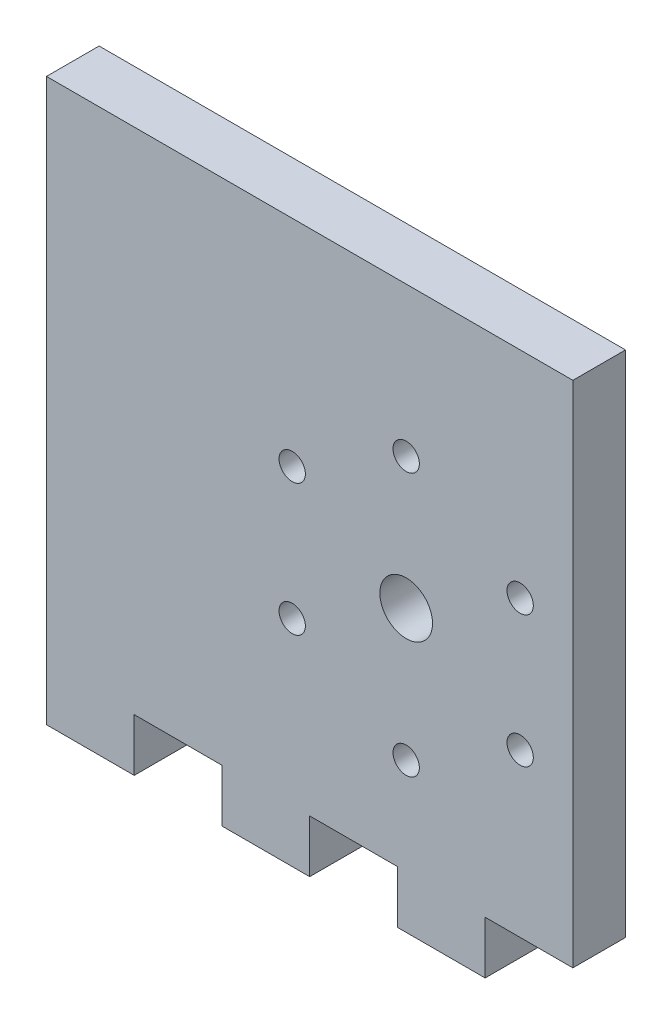
ISO-10303-21;
HEADER;
FILE_DESCRIPTION(('STEP AP214'),'2;1');
FILE_NAME('part.step','',(''),(''),'','','');
FILE_SCHEMA(('AUTOMOTIVE_DESIGN { 1 0 10303 214 1 1 1 1 }'));
ENDSEC;
DATA;
#1=APPLICATION_CONTEXT('core data for automotive mechanical design processes');
#2=APPLICATION_PROTOCOL_DEFINITION('international standard','automotive_design',2000,#1);
#3=PRODUCT_CONTEXT('',#1,'mechanical');
#4=PRODUCT('Part','Part','',(#3));
#5=PRODUCT_RELATED_PRODUCT_CATEGORY('part','',(#4));
#6=PRODUCT_DEFINITION_FORMATION('','',#4);
#7=PRODUCT_DEFINITION_CONTEXT('part definition',#1,'design');
#8=PRODUCT_DEFINITION('design','',#6,#7);
#9=PRODUCT_DEFINITION_SHAPE('','',#8);
#10=(LENGTH_UNIT() NAMED_UNIT(*) SI_UNIT(.MILLI.,.METRE.));
#11=(NAMED_UNIT(*) PLANE_ANGLE_UNIT() SI_UNIT($,.RADIAN.));
#12=(NAMED_UNIT(*) SI_UNIT($,.STERADIAN.) SOLID_ANGLE_UNIT());
#13=UNCERTAINTY_MEASURE_WITH_UNIT(LENGTH_MEASURE(1.E-05),#10,'distance_accuracy_value','');
#14=(GEOMETRIC_REPRESENTATION_CONTEXT(3) GLOBAL_UNCERTAINTY_ASSIGNED_CONTEXT((#13)) GLOBAL_UNIT_ASSIGNED_CONTEXT((#10,
#11,#12)) REPRESENTATION_CONTEXT('',''));
#15=CARTESIAN_POINT('',(0.,0.,0.));
#16=DIRECTION('',(0.,0.,1.));
#17=DIRECTION('',(1.,0.,0.));
#18=AXIS2_PLACEMENT_3D('',#15,#16,#17);
#19=CARTESIAN_POINT('',(0.,0.,3.));
#20=DIRECTION('',(0.,0.,-1.));
#21=DIRECTION('',(-1.,0.,0.));
#22=AXIS2_PLACEMENT_3D('',#19,#20,#21);
#23=PLANE('',#22);
#24=DIRECTION('',(0.,1.,0.));
#25=VECTOR('',#24,1.);
#26=CARTESIAN_POINT('',(30.,0.,3.));
#27=LINE('',#26,#25);
#28=CARTESIAN_POINT('',(30.,-26.,3.));
#29=VERTEX_POINT('',#28);
#30=CARTESIAN_POINT('',(30.,3.,3.));
#31=VERTEX_POINT('',#30);
#32=EDGE_CURVE('E106',#29,#31,#27,.T.);
#33=ORIENTED_EDGE('',*,*,#32,.T.);
#34=DIRECTION('',(-1.,0.,0.));
#35=VECTOR('',#34,1.);
#36=CARTESIAN_POINT('',(30.,3.,3.));
#37=LINE('',#36,#35);
#38=CARTESIAN_POINT('',(0.,3.,3.));
#39=VERTEX_POINT('',#38);
#40=EDGE_CURVE('E312',#31,#39,#37,.T.);
#41=ORIENTED_EDGE('',*,*,#40,.T.);
#42=DIRECTION('',(0.,-1.,0.));
#43=VECTOR('',#42,1.);
#44=CARTESIAN_POINT('',(0.,0.,3.));
#45=LINE('',#44,#43);
#46=CARTESIAN_POINT('',(0.,-29.,3.));
#47=VERTEX_POINT('',#46);
#48=EDGE_CURVE('E366',#39,#47,#45,.T.);
#49=ORIENTED_EDGE('',*,*,#48,.T.);
#50=DIRECTION('',(1.,0.,0.));
#51=VECTOR('',#50,1.);
#52=CARTESIAN_POINT('',(0.,-29.,3.));
#53=LINE('',#52,#51);
#54=CARTESIAN_POINT('',(4.99999999999994,-29.,3.));
#55=VERTEX_POINT('',#54);
#56=EDGE_CURVE('E213',#47,#55,#53,.T.);
#57=ORIENTED_EDGE('',*,*,#56,.T.);
#58=DIRECTION('',(0.,1.,0.));
#59=VECTOR('',#58,1.);
#60=CARTESIAN_POINT('',(4.99999999999994,-29.,3.));
#61=LINE('',#60,#59);
#62=CARTESIAN_POINT('',(4.99999999999994,-26.,3.));
#63=VERTEX_POINT('',#62);
#64=EDGE_CURVE('E236',#55,#63,#61,.T.);
#65=ORIENTED_EDGE('',*,*,#64,.T.);
#66=DIRECTION('',(1.,0.,0.));
#67=VECTOR('',#66,1.);
#68=CARTESIAN_POINT('',(4.99999999999994,-26.,3.));
#69=LINE('',#68,#67);
#70=CARTESIAN_POINT('',(9.99999999999994,-26.,3.));
#71=VERTEX_POINT('',#70);
#72=EDGE_CURVE('E233',#63,#71,#69,.T.);
#73=ORIENTED_EDGE('',*,*,#72,.T.);
#74=DIRECTION('',(0.,-1.,0.));
#75=VECTOR('',#74,1.);
#76=CARTESIAN_POINT('',(9.99999999999994,-26.,3.));
#77=LINE('',#76,#75);
#78=CARTESIAN_POINT('',(9.99999999999995,-29.,3.));
#79=VERTEX_POINT('',#78);
#80=EDGE_CURVE('E235',#71,#79,#77,.T.);
#81=ORIENTED_EDGE('',*,*,#80,.T.);
#82=DIRECTION('',(1.,0.,0.));
#83=VECTOR('',#82,1.);
#84=CARTESIAN_POINT('',(9.99999999999995,-29.,3.));
#85=LINE('',#84,#83);
#86=CARTESIAN_POINT('',(14.9999999999999,-29.,3.));
#87=VERTEX_POINT('',#86);
#88=EDGE_CURVE('E238',#79,#87,#85,.T.);
#89=ORIENTED_EDGE('',*,*,#88,.T.);
#90=DIRECTION('',(0.,1.,0.));
#91=VECTOR('',#90,1.);
#92=CARTESIAN_POINT('',(14.9999999999999,-29.,3.));
#93=LINE('',#92,#91);
#94=CARTESIAN_POINT('',(15.,-26.,3.));
#95=VERTEX_POINT('',#94);
#96=EDGE_CURVE('E244',#87,#95,#93,.T.);
#97=ORIENTED_EDGE('',*,*,#96,.T.);
#98=DIRECTION('',(1.,0.,0.));
#99=VECTOR('',#98,1.);
#100=CARTESIAN_POINT('',(15.,-26.,3.));
#101=LINE('',#100,#99);
#102=CARTESIAN_POINT('',(20.,-26.,3.));
#103=VERTEX_POINT('',#102);
#104=EDGE_CURVE('E141',#95,#103,#101,.T.);
#105=ORIENTED_EDGE('',*,*,#104,.T.);
#106=DIRECTION('',(0.,-1.,0.));
#107=VECTOR('',#106,1.);
#108=CARTESIAN_POINT('',(20.,-29.,3.));
#109=LINE('',#108,#107);
#110=CARTESIAN_POINT('',(20.,-29.,3.));
#111=VERTEX_POINT('',#110);
#112=EDGE_CURVE('E135',#103,#111,#109,.T.);
#113=ORIENTED_EDGE('',*,*,#112,.T.);
#114=DIRECTION('',(1.,0.,0.));
#115=VECTOR('',#114,1.);
#116=CARTESIAN_POINT('',(20.,-29.,3.));
#117=LINE('',#116,#115);
#118=CARTESIAN_POINT('',(25.,-29.,3.));
#119=VERTEX_POINT('',#118);
#120=EDGE_CURVE('E139',#111,#119,#117,.T.);
#121=ORIENTED_EDGE('',*,*,#120,.T.);
#122=DIRECTION('',(0.,1.,0.));
#123=VECTOR('',#122,1.);
#124=CARTESIAN_POINT('',(25.,-29.,3.));
#125=LINE('',#124,#123);
#126=CARTESIAN_POINT('',(25.,-26.,3.));
#127=VERTEX_POINT('',#126);
#128=EDGE_CURVE('E50',#119,#127,#125,.T.);
#129=ORIENTED_EDGE('',*,*,#128,.T.);
#130=DIRECTION('',(1.,0.,0.));
#131=VECTOR('',#130,1.);
#132=CARTESIAN_POINT('',(25.,-26.,3.));
#133=LINE('',#132,#131);
#134=EDGE_CURVE('E185',#127,#29,#133,.T.);
#135=ORIENTED_EDGE('',*,*,#134,.T.);
#136=EDGE_LOOP('',(#33,#41,#49,#57,#65,#73,#81,#89,#97,#105,#113,#121,#129,#135));
#137=FACE_BOUND('',#136,.T.);
#138=CARTESIAN_POINT('',(20.5,-5.50000000000007,3.));
#139=DIRECTION('',(0.,0.,1.));
#140=DIRECTION('',(1.,0.,0.));
#141=AXIS2_PLACEMENT_3D('',#138,#139,#140);
#142=CIRCLE('',#141,0.750000000000002);
#143=CARTESIAN_POINT('',(21.25,-5.50000000000007,3.));
#144=VERTEX_POINT('',#143);
#145=EDGE_CURVE('E163',#144,#144,#142,.T.);
#146=ORIENTED_EDGE('',*,*,#145,.F.);
#147=EDGE_LOOP('',(#146));
#148=FACE_BOUND('',#147,.T.);
#149=CARTESIAN_POINT('',(20.5,-13.0000000000001,3.));
#150=DIRECTION('',(0.,0.,1.));
#151=DIRECTION('',(1.,0.,0.));
#152=AXIS2_PLACEMENT_3D('',#149,#150,#151);
#153=CIRCLE('',#152,1.5);
#154=CARTESIAN_POINT('',(22.,-13.0000000000001,3.));
#155=VERTEX_POINT('',#154);
#156=EDGE_CURVE('E354',#155,#155,#153,.T.);
#157=ORIENTED_EDGE('',*,*,#156,.F.);
#158=EDGE_LOOP('',(#157));
#159=FACE_BOUND('',#158,.T.);
#160=CARTESIAN_POINT('',(26.9951905283833,-9.25000000000007,3.));
#161=DIRECTION('',(0.,0.,1.));
#162=DIRECTION('',(1.,0.,0.));
#163=AXIS2_PLACEMENT_3D('',#160,#161,#162);
#164=CIRCLE('',#163,0.750000000000002);
#165=CARTESIAN_POINT('',(27.7451905283833,-9.25000000000007,3.));
#166=VERTEX_POINT('',#165);
#167=EDGE_CURVE('E348',#166,#166,#164,.T.);
#168=ORIENTED_EDGE('',*,*,#167,.F.);
#169=EDGE_LOOP('',(#168));
#170=FACE_BOUND('',#169,.T.);
#171=CARTESIAN_POINT('',(26.9951905283833,-16.7500000000001,3.));
#172=DIRECTION('',(0.,0.,1.));
#173=DIRECTION('',(1.,0.,0.));
#174=AXIS2_PLACEMENT_3D('',#171,#172,#173);
#175=CIRCLE('',#174,0.750000000000005);
#176=CARTESIAN_POINT('',(27.7451905283833,-16.7500000000001,3.));
#177=VERTEX_POINT('',#176);
#178=EDGE_CURVE('E342',#177,#177,#175,.T.);
#179=ORIENTED_EDGE('',*,*,#178,.F.);
#180=EDGE_LOOP('',(#179));
#181=FACE_BOUND('',#180,.T.);
#182=CARTESIAN_POINT('',(20.5,-20.5000000000001,3.));
#183=DIRECTION('',(0.,0.,1.));
#184=DIRECTION('',(1.,0.,0.));
#185=AXIS2_PLACEMENT_3D('',#182,#183,#184);
#186=CIRCLE('',#185,0.750000000000002);
#187=CARTESIAN_POINT('',(21.25,-20.5000000000001,3.));
#188=VERTEX_POINT('',#187);
#189=EDGE_CURVE('E336',#188,#188,#186,.T.);
#190=ORIENTED_EDGE('',*,*,#189,.F.);
#191=EDGE_LOOP('',(#190));
#192=FACE_BOUND('',#191,.T.);
#193=CARTESIAN_POINT('',(14.0048094716167,-16.7500000000001,3.));
#194=DIRECTION('',(0.,0.,1.));
#195=DIRECTION('',(1.,0.,0.));
#196=AXIS2_PLACEMENT_3D('',#193,#194,#195);
#197=CIRCLE('',#196,0.750000000000002);
#198=CARTESIAN_POINT('',(14.7548094716167,-16.7500000000001,3.));
#199=VERTEX_POINT('',#198);
#200=EDGE_CURVE('E330',#199,#199,#197,.T.);
#201=ORIENTED_EDGE('',*,*,#200,.F.);
#202=EDGE_LOOP('',(#201));
#203=FACE_BOUND('',#202,.T.);
#204=CARTESIAN_POINT('',(14.0048094716167,-9.25000000000008,3.));
#205=DIRECTION('',(0.,0.,1.));
#206=DIRECTION('',(1.,0.,0.));
#207=AXIS2_PLACEMENT_3D('',#204,#205,#206);
#208=CIRCLE('',#207,0.750000000000002);
#209=CARTESIAN_POINT('',(14.7548094716167,-9.25000000000008,3.));
#210=VERTEX_POINT('',#209);
#211=EDGE_CURVE('E324',#210,#210,#208,.T.);
#212=ORIENTED_EDGE('',*,*,#211,.F.);
#213=EDGE_LOOP('',(#212));
#214=FACE_BOUND('',#213,.T.);
#215=ADVANCED_FACE('F33',(#137,#148,#159,#170,#181,#192,#203,#214),#23,.F.);
#216=CARTESIAN_POINT('',(0.,0.,0.));
#217=DIRECTION('',(0.,0.,-1.));
#218=DIRECTION('',(-1.,0.,0.));
#219=AXIS2_PLACEMENT_3D('',#216,#217,#218);
#220=PLANE('',#219);
#221=DIRECTION('',(0.,-1.,0.));
#222=VECTOR('',#221,1.);
#223=CARTESIAN_POINT('',(0.,0.,0.));
#224=LINE('',#223,#222);
#225=CARTESIAN_POINT('',(0.,3.,0.));
#226=VERTEX_POINT('',#225);
#227=CARTESIAN_POINT('',(0.,-29.,0.));
#228=VERTEX_POINT('',#227);
#229=EDGE_CURVE('E166',#226,#228,#224,.T.);
#230=ORIENTED_EDGE('',*,*,#229,.F.);
#231=DIRECTION('',(-1.,0.,0.));
#232=VECTOR('',#231,1.);
#233=CARTESIAN_POINT('',(30.,3.,0.));
#234=LINE('',#233,#232);
#235=CARTESIAN_POINT('',(30.,3.,0.));
#236=VERTEX_POINT('',#235);
#237=EDGE_CURVE('E317',#236,#226,#234,.T.);
#238=ORIENTED_EDGE('',*,*,#237,.F.);
#239=DIRECTION('',(0.,1.,0.));
#240=VECTOR('',#239,1.);
#241=CARTESIAN_POINT('',(30.,0.,0.));
#242=LINE('',#241,#240);
#243=CARTESIAN_POINT('',(30.,-26.,0.));
#244=VERTEX_POINT('',#243);
#245=EDGE_CURVE('E162',#244,#236,#242,.T.);
#246=ORIENTED_EDGE('',*,*,#245,.F.);
#247=DIRECTION('',(1.,0.,0.));
#248=VECTOR('',#247,1.);
#249=CARTESIAN_POINT('',(25.,-26.,0.));
#250=LINE('',#249,#248);
#251=CARTESIAN_POINT('',(25.,-26.,0.));
#252=VERTEX_POINT('',#251);
#253=EDGE_CURVE('E159',#252,#244,#250,.T.);
#254=ORIENTED_EDGE('',*,*,#253,.F.);
#255=DIRECTION('',(0.,1.,0.));
#256=VECTOR('',#255,1.);
#257=CARTESIAN_POINT('',(25.,-29.,0.));
#258=LINE('',#257,#256);
#259=CARTESIAN_POINT('',(25.,-29.,0.));
#260=VERTEX_POINT('',#259);
#261=EDGE_CURVE('E98',#260,#252,#258,.T.);
#262=ORIENTED_EDGE('',*,*,#261,.F.);
#263=DIRECTION('',(1.,0.,0.));
#264=VECTOR('',#263,1.);
#265=CARTESIAN_POINT('',(20.,-29.,0.));
#266=LINE('',#265,#264);
#267=CARTESIAN_POINT('',(20.,-29.,0.));
#268=VERTEX_POINT('',#267);
#269=EDGE_CURVE('E92',#268,#260,#266,.T.);
#270=ORIENTED_EDGE('',*,*,#269,.F.);
#271=DIRECTION('',(0.,-1.,0.));
#272=VECTOR('',#271,1.);
#273=CARTESIAN_POINT('',(20.,-29.,0.));
#274=LINE('',#273,#272);
#275=CARTESIAN_POINT('',(20.,-26.,0.));
#276=VERTEX_POINT('',#275);
#277=EDGE_CURVE('E149',#276,#268,#274,.T.);
#278=ORIENTED_EDGE('',*,*,#277,.F.);
#279=DIRECTION('',(1.,0.,0.));
#280=VECTOR('',#279,1.);
#281=CARTESIAN_POINT('',(15.,-26.,0.));
#282=LINE('',#281,#280);
#283=CARTESIAN_POINT('',(15.,-26.,0.));
#284=VERTEX_POINT('',#283);
#285=EDGE_CURVE('E180',#284,#276,#282,.T.);
#286=ORIENTED_EDGE('',*,*,#285,.F.);
#287=DIRECTION('',(0.,1.,0.));
#288=VECTOR('',#287,1.);
#289=CARTESIAN_POINT('',(14.9999999999999,-29.,0.));
#290=LINE('',#289,#288);
#291=CARTESIAN_POINT('',(14.9999999999999,-29.,0.));
#292=VERTEX_POINT('',#291);
#293=EDGE_CURVE('E178',#292,#284,#290,.T.);
#294=ORIENTED_EDGE('',*,*,#293,.F.);
#295=DIRECTION('',(1.,0.,0.));
#296=VECTOR('',#295,1.);
#297=CARTESIAN_POINT('',(9.99999999999995,-29.,0.));
#298=LINE('',#297,#296);
#299=CARTESIAN_POINT('',(9.99999999999995,-29.,0.));
#300=VERTEX_POINT('',#299);
#301=EDGE_CURVE('E176',#300,#292,#298,.T.);
#302=ORIENTED_EDGE('',*,*,#301,.F.);
#303=DIRECTION('',(0.,-1.,0.));
#304=VECTOR('',#303,1.);
#305=CARTESIAN_POINT('',(9.99999999999994,-26.,0.));
#306=LINE('',#305,#304);
#307=CARTESIAN_POINT('',(9.99999999999994,-26.,0.));
#308=VERTEX_POINT('',#307);
#309=EDGE_CURVE('E174',#308,#300,#306,.T.);
#310=ORIENTED_EDGE('',*,*,#309,.F.);
#311=DIRECTION('',(1.,0.,0.));
#312=VECTOR('',#311,1.);
#313=CARTESIAN_POINT('',(4.99999999999994,-26.,0.));
#314=LINE('',#313,#312);
#315=CARTESIAN_POINT('',(4.99999999999994,-26.,0.));
#316=VERTEX_POINT('',#315);
#317=EDGE_CURVE('E172',#316,#308,#314,.T.);
#318=ORIENTED_EDGE('',*,*,#317,.F.);
#319=DIRECTION('',(0.,1.,0.));
#320=VECTOR('',#319,1.);
#321=CARTESIAN_POINT('',(4.99999999999994,-29.,0.));
#322=LINE('',#321,#320);
#323=CARTESIAN_POINT('',(4.99999999999994,-29.,0.));
#324=VERTEX_POINT('',#323);
#325=EDGE_CURVE('E170',#324,#316,#322,.T.);
#326=ORIENTED_EDGE('',*,*,#325,.F.);
#327=DIRECTION('',(1.,0.,0.));
#328=VECTOR('',#327,1.);
#329=CARTESIAN_POINT('',(0.,-29.,0.));
#330=LINE('',#329,#328);
#331=EDGE_CURVE('E168',#228,#324,#330,.T.);
#332=ORIENTED_EDGE('',*,*,#331,.F.);
#333=EDGE_LOOP('',(#230,#238,#246,#254,#262,#270,#278,#286,#294,#302,#310,#318,#326,#332));
#334=FACE_BOUND('',#333,.T.);
#335=CARTESIAN_POINT('',(14.0048094716167,-16.7500000000001,0.));
#336=DIRECTION('',(0.,0.,1.));
#337=DIRECTION('',(1.,0.,0.));
#338=AXIS2_PLACEMENT_3D('',#335,#336,#337);
#339=CIRCLE('',#338,0.750000000000002);
#340=CARTESIAN_POINT('',(14.7548094716167,-16.7500000000001,0.));
#341=VERTEX_POINT('',#340);
#342=EDGE_CURVE('E327',#341,#341,#339,.T.);
#343=ORIENTED_EDGE('',*,*,#342,.T.);
#344=EDGE_LOOP('',(#343));
#345=FACE_BOUND('',#344,.T.);
#346=CARTESIAN_POINT('',(26.9951905283833,-16.7500000000001,0.));
#347=DIRECTION('',(0.,0.,1.));
#348=DIRECTION('',(1.,0.,0.));
#349=AXIS2_PLACEMENT_3D('',#346,#347,#348);
#350=CIRCLE('',#349,0.750000000000005);
#351=CARTESIAN_POINT('',(27.7451905283833,-16.7500000000001,0.));
#352=VERTEX_POINT('',#351);
#353=EDGE_CURVE('E339',#352,#352,#350,.T.);
#354=ORIENTED_EDGE('',*,*,#353,.T.);
#355=EDGE_LOOP('',(#354));
#356=FACE_BOUND('',#355,.T.);
#357=CARTESIAN_POINT('',(20.5,-13.0000000000001,0.));
#358=DIRECTION('',(0.,0.,1.));
#359=DIRECTION('',(1.,0.,0.));
#360=AXIS2_PLACEMENT_3D('',#357,#358,#359);
#361=CIRCLE('',#360,1.5);
#362=CARTESIAN_POINT('',(22.,-13.0000000000001,0.));
#363=VERTEX_POINT('',#362);
#364=EDGE_CURVE('E351',#363,#363,#361,.T.);
#365=ORIENTED_EDGE('',*,*,#364,.T.);
#366=EDGE_LOOP('',(#365));
#367=FACE_BOUND('',#366,.T.);
#368=CARTESIAN_POINT('',(20.5,-5.50000000000007,0.));
#369=DIRECTION('',(0.,0.,1.));
#370=DIRECTION('',(1.,0.,0.));
#371=AXIS2_PLACEMENT_3D('',#368,#369,#370);
#372=CIRCLE('',#371,0.750000000000002);
#373=CARTESIAN_POINT('',(21.25,-5.50000000000007,0.));
#374=VERTEX_POINT('',#373);
#375=EDGE_CURVE('E357',#374,#374,#372,.T.);
#376=ORIENTED_EDGE('',*,*,#375,.T.);
#377=EDGE_LOOP('',(#376));
#378=FACE_BOUND('',#377,.T.);
#379=CARTESIAN_POINT('',(26.9951905283833,-9.25000000000007,0.));
#380=DIRECTION('',(0.,0.,1.));
#381=DIRECTION('',(1.,0.,0.));
#382=AXIS2_PLACEMENT_3D('',#379,#380,#381);
#383=CIRCLE('',#382,0.750000000000002);
#384=CARTESIAN_POINT('',(27.7451905283833,-9.25000000000007,0.));
#385=VERTEX_POINT('',#384);
#386=EDGE_CURVE('E345',#385,#385,#383,.T.);
#387=ORIENTED_EDGE('',*,*,#386,.T.);
#388=EDGE_LOOP('',(#387));
#389=FACE_BOUND('',#388,.T.);
#390=CARTESIAN_POINT('',(20.5,-20.5000000000001,0.));
#391=DIRECTION('',(0.,0.,1.));
#392=DIRECTION('',(1.,0.,0.));
#393=AXIS2_PLACEMENT_3D('',#390,#391,#392);
#394=CIRCLE('',#393,0.750000000000002);
#395=CARTESIAN_POINT('',(21.25,-20.5000000000001,0.));
#396=VERTEX_POINT('',#395);
#397=EDGE_CURVE('E333',#396,#396,#394,.T.);
#398=ORIENTED_EDGE('',*,*,#397,.T.);
#399=EDGE_LOOP('',(#398));
#400=FACE_BOUND('',#399,.T.);
#401=CARTESIAN_POINT('',(14.0048094716167,-9.25000000000008,0.));
#402=DIRECTION('',(0.,0.,1.));
#403=DIRECTION('',(1.,0.,0.));
#404=AXIS2_PLACEMENT_3D('',#401,#402,#403);
#405=CIRCLE('',#404,0.750000000000002);
#406=CARTESIAN_POINT('',(14.7548094716167,-9.25000000000008,0.));
#407=VERTEX_POINT('',#406);
#408=EDGE_CURVE('E322',#407,#407,#405,.T.);
#409=ORIENTED_EDGE('',*,*,#408,.T.);
#410=EDGE_LOOP('',(#409));
#411=FACE_BOUND('',#410,.T.);
#412=ADVANCED_FACE('F219',(#334,#345,#356,#367,#378,#389,#400,#411),#220,.T.);
#413=CARTESIAN_POINT('',(25.,-26.,3.));
#414=DIRECTION('',(0.,1.,0.));
#415=DIRECTION('',(-1.,0.,0.));
#416=AXIS2_PLACEMENT_3D('',#413,#414,#415);
#417=PLANE('',#416);
#418=ORIENTED_EDGE('',*,*,#253,.T.);
#419=DIRECTION('',(0.,0.,-1.));
#420=VECTOR('',#419,1.);
#421=CARTESIAN_POINT('',(30.,-26.,3.));
#422=LINE('',#421,#420);
#423=EDGE_CURVE('E11',#29,#244,#422,.T.);
#424=ORIENTED_EDGE('',*,*,#423,.F.);
#425=ORIENTED_EDGE('',*,*,#134,.F.);
#426=DIRECTION('',(0.,0.,-1.));
#427=VECTOR('',#426,1.);
#428=CARTESIAN_POINT('',(25.,-26.,3.));
#429=LINE('',#428,#427);
#430=EDGE_CURVE('E155',#127,#252,#429,.T.);
#431=ORIENTED_EDGE('',*,*,#430,.T.);
#432=EDGE_LOOP('',(#418,#424,#425,#431));
#433=FACE_BOUND('',#432,.T.);
#434=ADVANCED_FACE('F35',(#433),#417,.F.);
#435=CARTESIAN_POINT('',(30.,0.,3.));
#436=DIRECTION('',(-1.,0.,0.));
#437=DIRECTION('',(0.,-1.,0.));
#438=AXIS2_PLACEMENT_3D('',#435,#436,#437);
#439=PLANE('',#438);
#440=ORIENTED_EDGE('',*,*,#245,.T.);
#441=DIRECTION('',(0.,0.,1.));
#442=VECTOR('',#441,1.);
#443=CARTESIAN_POINT('',(30.,3.,0.));
#444=LINE('',#443,#442);
#445=EDGE_CURVE('E315',#236,#31,#444,.T.);
#446=ORIENTED_EDGE('',*,*,#445,.T.);
#447=ORIENTED_EDGE('',*,*,#32,.F.);
#448=ORIENTED_EDGE('',*,*,#423,.T.);
#449=EDGE_LOOP('',(#440,#446,#447,#448));
#450=FACE_BOUND('',#449,.T.);
#451=ADVANCED_FACE('F370',(#450),#439,.F.);
#452=CARTESIAN_POINT('',(0.,0.,3.));
#453=DIRECTION('',(1.,0.,0.));
#454=DIRECTION('',(0.,1.,0.));
#455=AXIS2_PLACEMENT_3D('',#452,#453,#454);
#456=PLANE('',#455);
#457=ORIENTED_EDGE('',*,*,#229,.T.);
#458=DIRECTION('',(0.,0.,-1.));
#459=VECTOR('',#458,1.);
#460=CARTESIAN_POINT('',(0.,-29.,3.));
#461=LINE('',#460,#459);
#462=EDGE_CURVE('E42',#47,#228,#461,.T.);
#463=ORIENTED_EDGE('',*,*,#462,.F.);
#464=ORIENTED_EDGE('',*,*,#48,.F.);
#465=DIRECTION('',(0.,0.,1.));
#466=VECTOR('',#465,1.);
#467=CARTESIAN_POINT('',(0.,3.,0.));
#468=LINE('',#467,#466);
#469=EDGE_CURVE('E316',#226,#39,#468,.T.);
#470=ORIENTED_EDGE('',*,*,#469,.F.);
#471=EDGE_LOOP('',(#457,#463,#464,#470));
#472=FACE_BOUND('',#471,.T.);
#473=ADVANCED_FACE('F367',(#472),#456,.F.);
#474=CARTESIAN_POINT('',(0.,-29.,3.));
#475=DIRECTION('',(0.,1.,0.));
#476=DIRECTION('',(0.,0.,1.));
#477=AXIS2_PLACEMENT_3D('',#474,#475,#476);
#478=PLANE('',#477);
#479=ORIENTED_EDGE('',*,*,#331,.T.);
#480=DIRECTION('',(0.,0.,-1.));
#481=VECTOR('',#480,1.);
#482=CARTESIAN_POINT('',(4.99999999999994,-29.,3.));
#483=LINE('',#482,#481);
#484=EDGE_CURVE('E204',#55,#324,#483,.T.);
#485=ORIENTED_EDGE('',*,*,#484,.F.);
#486=ORIENTED_EDGE('',*,*,#56,.F.);
#487=ORIENTED_EDGE('',*,*,#462,.T.);
#488=EDGE_LOOP('',(#479,#485,#486,#487));
#489=FACE_BOUND('',#488,.T.);
#490=ADVANCED_FACE('F211',(#489),#478,.F.);
#491=CARTESIAN_POINT('',(4.99999999999994,-29.,3.));
#492=DIRECTION('',(-1.,0.,0.));
#493=DIRECTION('',(0.,0.,1.));
#494=AXIS2_PLACEMENT_3D('',#491,#492,#493);
#495=PLANE('',#494);
#496=ORIENTED_EDGE('',*,*,#325,.T.);
#497=DIRECTION('',(0.,0.,-1.));
#498=VECTOR('',#497,1.);
#499=CARTESIAN_POINT('',(4.99999999999994,-26.,3.));
#500=LINE('',#499,#498);
#501=EDGE_CURVE('E201',#63,#316,#500,.T.);
#502=ORIENTED_EDGE('',*,*,#501,.F.);
#503=ORIENTED_EDGE('',*,*,#64,.F.);
#504=ORIENTED_EDGE('',*,*,#484,.T.);
#505=EDGE_LOOP('',(#496,#502,#503,#504));
#506=FACE_BOUND('',#505,.T.);
#507=ADVANCED_FACE('F227',(#506),#495,.F.);
#508=CARTESIAN_POINT('',(4.99999999999994,-26.,3.));
#509=DIRECTION('',(0.,1.,0.));
#510=DIRECTION('',(-1.,0.,0.));
#511=AXIS2_PLACEMENT_3D('',#508,#509,#510);
#512=PLANE('',#511);
#513=ORIENTED_EDGE('',*,*,#317,.T.);
#514=DIRECTION('',(0.,0.,-1.));
#515=VECTOR('',#514,1.);
#516=CARTESIAN_POINT('',(9.99999999999994,-26.,3.));
#517=LINE('',#516,#515);
#518=EDGE_CURVE('E198',#71,#308,#517,.T.);
#519=ORIENTED_EDGE('',*,*,#518,.F.);
#520=ORIENTED_EDGE('',*,*,#72,.F.);
#521=ORIENTED_EDGE('',*,*,#501,.T.);
#522=EDGE_LOOP('',(#513,#519,#520,#521));
#523=FACE_BOUND('',#522,.T.);
#524=ADVANCED_FACE('F231',(#523),#512,.F.);
#525=CARTESIAN_POINT('',(9.99999999999994,-26.,3.));
#526=DIRECTION('',(1.,0.,0.));
#527=DIRECTION('',(0.,1.,0.));
#528=AXIS2_PLACEMENT_3D('',#525,#526,#527);
#529=PLANE('',#528);
#530=ORIENTED_EDGE('',*,*,#309,.T.);
#531=DIRECTION('',(0.,0.,-1.));
#532=VECTOR('',#531,1.);
#533=CARTESIAN_POINT('',(9.99999999999995,-29.,3.));
#534=LINE('',#533,#532);
#535=EDGE_CURVE('E195',#79,#300,#534,.T.);
#536=ORIENTED_EDGE('',*,*,#535,.F.);
#537=ORIENTED_EDGE('',*,*,#80,.F.);
#538=ORIENTED_EDGE('',*,*,#518,.T.);
#539=EDGE_LOOP('',(#530,#536,#537,#538));
#540=FACE_BOUND('',#539,.T.);
#541=ADVANCED_FACE('F383',(#540),#529,.F.);
#542=CARTESIAN_POINT('',(9.99999999999995,-29.,3.));
#543=DIRECTION('',(0.,1.,0.));
#544=DIRECTION('',(0.,0.,1.));
#545=AXIS2_PLACEMENT_3D('',#542,#543,#544);
#546=PLANE('',#545);
#547=ORIENTED_EDGE('',*,*,#301,.T.);
#548=DIRECTION('',(0.,0.,-1.));
#549=VECTOR('',#548,1.);
#550=CARTESIAN_POINT('',(14.9999999999999,-29.,3.));
#551=LINE('',#550,#549);
#552=EDGE_CURVE('E192',#87,#292,#551,.T.);
#553=ORIENTED_EDGE('',*,*,#552,.F.);
#554=ORIENTED_EDGE('',*,*,#88,.F.);
#555=ORIENTED_EDGE('',*,*,#535,.T.);
#556=EDGE_LOOP('',(#547,#553,#554,#555));
#557=FACE_BOUND('',#556,.T.);
#558=ADVANCED_FACE('F386',(#557),#546,.F.);
#559=CARTESIAN_POINT('',(14.9999999999999,-29.,3.));
#560=DIRECTION('',(-1.,0.,0.));
#561=DIRECTION('',(0.,-1.,0.));
#562=AXIS2_PLACEMENT_3D('',#559,#560,#561);
#563=PLANE('',#562);
#564=ORIENTED_EDGE('',*,*,#293,.T.);
#565=DIRECTION('',(0.,0.,-1.));
#566=VECTOR('',#565,1.);
#567=CARTESIAN_POINT('',(15.,-26.,3.));
#568=LINE('',#567,#566);
#569=EDGE_CURVE('E189',#95,#284,#568,.T.);
#570=ORIENTED_EDGE('',*,*,#569,.F.);
#571=ORIENTED_EDGE('',*,*,#96,.F.);
#572=ORIENTED_EDGE('',*,*,#552,.T.);
#573=EDGE_LOOP('',(#564,#570,#571,#572));
#574=FACE_BOUND('',#573,.T.);
#575=ADVANCED_FACE('F250',(#574),#563,.F.);
#576=CARTESIAN_POINT('',(15.,-26.,3.));
#577=DIRECTION('',(0.,1.,0.));
#578=DIRECTION('',(-1.,0.,0.));
#579=AXIS2_PLACEMENT_3D('',#576,#577,#578);
#580=PLANE('',#579);
#581=ORIENTED_EDGE('',*,*,#285,.T.);
#582=DIRECTION('',(0.,0.,-1.));
#583=VECTOR('',#582,1.);
#584=CARTESIAN_POINT('',(20.,-26.,3.));
#585=LINE('',#584,#583);
#586=EDGE_CURVE('E150',#103,#276,#585,.T.);
#587=ORIENTED_EDGE('',*,*,#586,.F.);
#588=ORIENTED_EDGE('',*,*,#104,.F.);
#589=ORIENTED_EDGE('',*,*,#569,.T.);
#590=EDGE_LOOP('',(#581,#587,#588,#589));
#591=FACE_BOUND('',#590,.T.);
#592=ADVANCED_FACE('F254',(#591),#580,.F.);
#593=CARTESIAN_POINT('',(20.,-29.,3.));
#594=DIRECTION('',(1.,0.,0.));
#595=DIRECTION('',(0.,1.,0.));
#596=AXIS2_PLACEMENT_3D('',#593,#594,#595);
#597=PLANE('',#596);
#598=ORIENTED_EDGE('',*,*,#277,.T.);
#599=DIRECTION('',(0.,0.,-1.));
#600=VECTOR('',#599,1.);
#601=CARTESIAN_POINT('',(20.,-29.,3.));
#602=LINE('',#601,#600);
#603=EDGE_CURVE('E146',#111,#268,#602,.T.);
#604=ORIENTED_EDGE('',*,*,#603,.F.);
#605=ORIENTED_EDGE('',*,*,#112,.F.);
#606=ORIENTED_EDGE('',*,*,#586,.T.);
#607=EDGE_LOOP('',(#598,#604,#605,#606));
#608=FACE_BOUND('',#607,.T.);
#609=ADVANCED_FACE('F147',(#608),#597,.F.);
#610=CARTESIAN_POINT('',(20.,-29.,3.));
#611=DIRECTION('',(0.,1.,0.));
#612=DIRECTION('',(-1.,0.,0.));
#613=AXIS2_PLACEMENT_3D('',#610,#611,#612);
#614=PLANE('',#613);
#615=ORIENTED_EDGE('',*,*,#269,.T.);
#616=DIRECTION('',(0.,0.,-1.));
#617=VECTOR('',#616,1.);
#618=CARTESIAN_POINT('',(25.,-29.,3.));
#619=LINE('',#618,#617);
#620=EDGE_CURVE('E151',#119,#260,#619,.T.);
#621=ORIENTED_EDGE('',*,*,#620,.F.);
#622=ORIENTED_EDGE('',*,*,#120,.F.);
#623=ORIENTED_EDGE('',*,*,#603,.T.);
#624=EDGE_LOOP('',(#615,#621,#622,#623));
#625=FACE_BOUND('',#624,.T.);
#626=ADVANCED_FACE('F153',(#625),#614,.F.);
#627=CARTESIAN_POINT('',(25.,-29.,3.));
#628=DIRECTION('',(-1.,0.,0.));
#629=DIRECTION('',(0.,-1.,0.));
#630=AXIS2_PLACEMENT_3D('',#627,#628,#629);
#631=PLANE('',#630);
#632=ORIENTED_EDGE('',*,*,#261,.T.);
#633=ORIENTED_EDGE('',*,*,#430,.F.);
#634=ORIENTED_EDGE('',*,*,#128,.F.);
#635=ORIENTED_EDGE('',*,*,#620,.T.);
#636=EDGE_LOOP('',(#632,#633,#634,#635));
#637=FACE_BOUND('',#636,.T.);
#638=ADVANCED_FACE('F259',(#637),#631,.F.);
#639=CARTESIAN_POINT('',(20.5,-5.50000000000007,3.));
#640=DIRECTION('',(0.,0.,-1.));
#641=DIRECTION('',(-1.,0.,0.));
#642=AXIS2_PLACEMENT_3D('',#639,#640,#641);
#643=CYLINDRICAL_SURFACE('',#642,0.750000000000002);
#644=ORIENTED_EDGE('',*,*,#145,.T.);
#645=EDGE_LOOP('',(#644));
#646=FACE_BOUND('',#645,.T.);
#647=ORIENTED_EDGE('',*,*,#375,.F.);
#648=EDGE_LOOP('',(#647));
#649=FACE_BOUND('',#648,.T.);
#650=ADVANCED_FACE('F261',(#646,#649),#643,.F.);
#651=CARTESIAN_POINT('',(20.5,-13.0000000000001,3.));
#652=DIRECTION('',(0.,0.,-1.));
#653=DIRECTION('',(-1.,0.,0.));
#654=AXIS2_PLACEMENT_3D('',#651,#652,#653);
#655=CYLINDRICAL_SURFACE('',#654,1.5);
#656=ORIENTED_EDGE('',*,*,#156,.T.);
#657=EDGE_LOOP('',(#656));
#658=FACE_BOUND('',#657,.T.);
#659=ORIENTED_EDGE('',*,*,#364,.F.);
#660=EDGE_LOOP('',(#659));
#661=FACE_BOUND('',#660,.T.);
#662=ADVANCED_FACE('F267',(#658,#661),#655,.F.);
#663=CARTESIAN_POINT('',(26.9951905283833,-9.25000000000007,3.));
#664=DIRECTION('',(0.,0.,-1.));
#665=DIRECTION('',(-1.,0.,0.));
#666=AXIS2_PLACEMENT_3D('',#663,#664,#665);
#667=CYLINDRICAL_SURFACE('',#666,0.750000000000002);
#668=ORIENTED_EDGE('',*,*,#167,.T.);
#669=EDGE_LOOP('',(#668));
#670=FACE_BOUND('',#669,.T.);
#671=ORIENTED_EDGE('',*,*,#386,.F.);
#672=EDGE_LOOP('',(#671));
#673=FACE_BOUND('',#672,.T.);
#674=ADVANCED_FACE('F281',(#670,#673),#667,.F.);
#675=CARTESIAN_POINT('',(26.9951905283833,-16.7500000000001,3.));
#676=DIRECTION('',(0.,0.,-1.));
#677=DIRECTION('',(-1.,0.,0.));
#678=AXIS2_PLACEMENT_3D('',#675,#676,#677);
#679=CYLINDRICAL_SURFACE('',#678,0.750000000000005);
#680=ORIENTED_EDGE('',*,*,#178,.T.);
#681=EDGE_LOOP('',(#680));
#682=FACE_BOUND('',#681,.T.);
#683=ORIENTED_EDGE('',*,*,#353,.F.);
#684=EDGE_LOOP('',(#683));
#685=FACE_BOUND('',#684,.T.);
#686=ADVANCED_FACE('F285',(#682,#685),#679,.F.);
#687=CARTESIAN_POINT('',(20.5,-20.5000000000001,3.));
#688=DIRECTION('',(0.,0.,-1.));
#689=DIRECTION('',(-1.,0.,0.));
#690=AXIS2_PLACEMENT_3D('',#687,#688,#689);
#691=CYLINDRICAL_SURFACE('',#690,0.750000000000002);
#692=ORIENTED_EDGE('',*,*,#189,.T.);
#693=EDGE_LOOP('',(#692));
#694=FACE_BOUND('',#693,.T.);
#695=ORIENTED_EDGE('',*,*,#397,.F.);
#696=EDGE_LOOP('',(#695));
#697=FACE_BOUND('',#696,.T.);
#698=ADVANCED_FACE('F289',(#694,#697),#691,.F.);
#699=CARTESIAN_POINT('',(14.0048094716167,-16.7500000000001,3.));
#700=DIRECTION('',(0.,0.,-1.));
#701=DIRECTION('',(-1.,0.,0.));
#702=AXIS2_PLACEMENT_3D('',#699,#700,#701);
#703=CYLINDRICAL_SURFACE('',#702,0.750000000000002);
#704=ORIENTED_EDGE('',*,*,#200,.T.);
#705=EDGE_LOOP('',(#704));
#706=FACE_BOUND('',#705,.T.);
#707=ORIENTED_EDGE('',*,*,#342,.F.);
#708=EDGE_LOOP('',(#707));
#709=FACE_BOUND('',#708,.T.);
#710=ADVANCED_FACE('F293',(#706,#709),#703,.F.);
#711=CARTESIAN_POINT('',(14.0048094716167,-9.25000000000008,3.));
#712=DIRECTION('',(0.,0.,-1.));
#713=DIRECTION('',(-1.,0.,0.));
#714=AXIS2_PLACEMENT_3D('',#711,#712,#713);
#715=CYLINDRICAL_SURFACE('',#714,0.750000000000002);
#716=ORIENTED_EDGE('',*,*,#211,.T.);
#717=EDGE_LOOP('',(#716));
#718=FACE_BOUND('',#717,.T.);
#719=ORIENTED_EDGE('',*,*,#408,.F.);
#720=EDGE_LOOP('',(#719));
#721=FACE_BOUND('',#720,.T.);
#722=ADVANCED_FACE('F297',(#718,#721),#715,.F.);
#723=CARTESIAN_POINT('',(30.,3.,0.));
#724=DIRECTION('',(0.,1.,0.));
#725=DIRECTION('',(-1.,0.,0.));
#726=AXIS2_PLACEMENT_3D('',#723,#724,#725);
#727=PLANE('',#726);
#728=ORIENTED_EDGE('',*,*,#40,.F.);
#729=ORIENTED_EDGE('',*,*,#445,.F.);
#730=ORIENTED_EDGE('',*,*,#237,.T.);
#731=ORIENTED_EDGE('',*,*,#469,.T.);
#732=EDGE_LOOP('',(#728,#729,#730,#731));
#733=FACE_BOUND('',#732,.T.);
#734=ADVANCED_FACE('F300',(#733),#727,.T.);
#735=CLOSED_SHELL('',(#215,#412,#434,#451,#473,#490,#507,#524,#541,#558,#575,#592,#609,#626,
#638,#650,#662,#674,#686,#698,#710,#722,#734));
#736=MANIFOLD_SOLID_BREP('B2',#735);
#737=ADVANCED_BREP_SHAPE_REPRESENTATION('',(#18,#736),#14);
#738=SHAPE_DEFINITION_REPRESENTATION(#9,#737);
ENDSEC;
END-ISO-10303-21;
